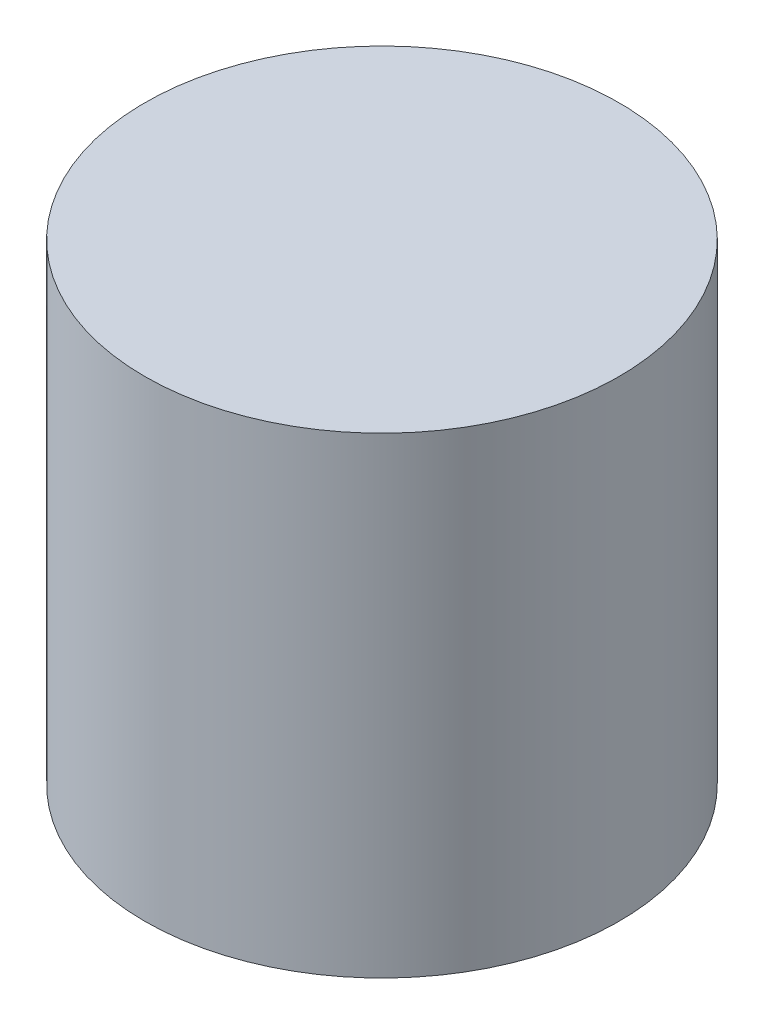
ISO-10303-21;
HEADER;
FILE_DESCRIPTION(('STEP AP214'),'2;1');
FILE_NAME('part.step','',(''),(''),'','','');
FILE_SCHEMA(('AUTOMOTIVE_DESIGN { 1 0 10303 214 1 1 1 1 }'));
ENDSEC;
DATA;
#1=APPLICATION_CONTEXT('core data for automotive mechanical design processes');
#2=APPLICATION_PROTOCOL_DEFINITION('international standard','automotive_design',2000,#1);
#3=PRODUCT_CONTEXT('',#1,'mechanical');
#4=PRODUCT('Part','Part','',(#3));
#5=PRODUCT_RELATED_PRODUCT_CATEGORY('part','',(#4));
#6=PRODUCT_DEFINITION_FORMATION('','',#4);
#7=PRODUCT_DEFINITION_CONTEXT('part definition',#1,'design');
#8=PRODUCT_DEFINITION('design','',#6,#7);
#9=PRODUCT_DEFINITION_SHAPE('','',#8);
#10=(LENGTH_UNIT() NAMED_UNIT(*) SI_UNIT(.MILLI.,.METRE.));
#11=(NAMED_UNIT(*) PLANE_ANGLE_UNIT() SI_UNIT($,.RADIAN.));
#12=(NAMED_UNIT(*) SI_UNIT($,.STERADIAN.) SOLID_ANGLE_UNIT());
#13=UNCERTAINTY_MEASURE_WITH_UNIT(LENGTH_MEASURE(1.E-05),#10,'distance_accuracy_value','');
#14=(GEOMETRIC_REPRESENTATION_CONTEXT(3) GLOBAL_UNCERTAINTY_ASSIGNED_CONTEXT((#13)) GLOBAL_UNIT_ASSIGNED_CONTEXT((#10,
#11,#12)) REPRESENTATION_CONTEXT('',''));
#15=CARTESIAN_POINT('',(0.,0.,0.));
#16=DIRECTION('',(0.,0.,1.));
#17=DIRECTION('',(1.,0.,0.));
#18=AXIS2_PLACEMENT_3D('',#15,#16,#17);
#19=CARTESIAN_POINT('',(0.,0.,0.));
#20=DIRECTION('',(0.,1.,0.));
#21=DIRECTION('',(0.,0.,1.));
#22=AXIS2_PLACEMENT_3D('',#19,#20,#21);
#23=PLANE('',#22);
#24=CARTESIAN_POINT('',(-12.5,0.,26.56));
#25=DIRECTION('',(0.,1.,0.));
#26=DIRECTION('',(0.,0.,-1.));
#27=AXIS2_PLACEMENT_3D('',#24,#25,#26);
#28=CIRCLE('',#27,2.75);
#29=CARTESIAN_POINT('',(-12.5,0.,23.81));
#30=VERTEX_POINT('',#29);
#31=EDGE_CURVE('E377',#30,#30,#28,.T.);
#32=ORIENTED_EDGE('',*,*,#31,.T.);
#33=EDGE_LOOP('',(#32));
#34=FACE_BOUND('',#33,.T.);
#35=CARTESIAN_POINT('',(-20.,0.,19.06));
#36=DIRECTION('',(0.,1.,0.));
#37=DIRECTION('',(0.,0.,-1.));
#38=AXIS2_PLACEMENT_3D('',#35,#36,#37);
#39=CIRCLE('',#38,4.9);
#40=CARTESIAN_POINT('',(-20.,0.,14.16));
#41=VERTEX_POINT('',#40);
#42=EDGE_CURVE('E386',#41,#41,#39,.T.);
#43=ORIENTED_EDGE('',*,*,#42,.T.);
#44=EDGE_LOOP('',(#43));
#45=FACE_BOUND('',#44,.T.);
#46=CARTESIAN_POINT('',(12.5,0.,26.56));
#47=DIRECTION('',(0.,1.,0.));
#48=DIRECTION('',(0.,0.,1.));
#49=AXIS2_PLACEMENT_3D('',#46,#47,#48);
#50=CIRCLE('',#49,2.75);
#51=CARTESIAN_POINT('',(12.5,0.,29.31));
#52=VERTEX_POINT('',#51);
#53=EDGE_CURVE('E396',#52,#52,#50,.T.);
#54=ORIENTED_EDGE('',*,*,#53,.T.);
#55=EDGE_LOOP('',(#54));
#56=FACE_BOUND('',#55,.T.);
#57=CARTESIAN_POINT('',(20.,0.,19.06));
#58=DIRECTION('',(0.,1.,0.));
#59=DIRECTION('',(0.,0.,1.));
#60=AXIS2_PLACEMENT_3D('',#57,#58,#59);
#61=CIRCLE('',#60,4.90000000000001);
#62=CARTESIAN_POINT('',(20.,0.,23.96));
#63=VERTEX_POINT('',#62);
#64=EDGE_CURVE('E376',#63,#63,#61,.T.);
#65=ORIENTED_EDGE('',*,*,#64,.T.);
#66=EDGE_LOOP('',(#65));
#67=FACE_BOUND('',#66,.T.);
#68=CARTESIAN_POINT('',(0.,0.,23.44));
#69=DIRECTION('',(0.,1.,0.));
#70=DIRECTION('',(0.,0.,1.));
#71=AXIS2_PLACEMENT_3D('',#68,#69,#70);
#72=CIRCLE('',#71,8.);
#73=CARTESIAN_POINT('',(0.,0.,31.44));
#74=VERTEX_POINT('',#73);
#75=EDGE_CURVE('E390',#74,#74,#72,.T.);
#76=ORIENTED_EDGE('',*,*,#75,.T.);
#77=EDGE_LOOP('',(#76));
#78=FACE_BOUND('',#77,.T.);
#79=CARTESIAN_POINT('',(-6.24500451351651E-13,0.,1.23165366794353E-13));
#80=DIRECTION('',(0.,1.,0.));
#81=DIRECTION('',(0.,0.,1.));
#82=AXIS2_PLACEMENT_3D('',#79,#80,#81);
#83=CIRCLE('',#82,33.6999999999995);
#84=CARTESIAN_POINT('',(-29.0000000000006,0.,-17.1665372163393));
#85=VERTEX_POINT('',#84);
#86=CARTESIAN_POINT('',(-29.0000000000007,0.,17.1665372163394));
#87=VERTEX_POINT('',#86);
#88=EDGE_CURVE('E151',#85,#87,#83,.T.);
#89=ORIENTED_EDGE('',*,*,#88,.T.);
#90=CARTESIAN_POINT('',(-23.5310930994231,0.,13.9292201873236));
#91=DIRECTION('',(0.,-1.,0.));
#92=DIRECTION('',(0.,0.,1.));
#93=AXIS2_PLACEMENT_3D('',#90,#91,#92);
#94=CIRCLE('',#93,6.35524698446404);
#95=CARTESIAN_POINT('',(-29.7370902241538,0.,12.56));
#96=VERTEX_POINT('',#95);
#97=EDGE_CURVE('E48',#87,#96,#94,.T.);
#98=ORIENTED_EDGE('',*,*,#97,.T.);
#99=DIRECTION('',(1.,0.,0.));
#100=VECTOR('',#99,1.);
#101=CARTESIAN_POINT('',(29.7370902241538,0.,12.56));
#102=LINE('',#101,#100);
#103=CARTESIAN_POINT('',(29.7370902241538,0.,12.56));
#104=VERTEX_POINT('',#103);
#105=EDGE_CURVE('E135',#96,#104,#102,.T.);
#106=ORIENTED_EDGE('',*,*,#105,.T.);
#107=CARTESIAN_POINT('',(23.5310930994231,0.,13.9292201873236));
#108=DIRECTION('',(0.,-1.,0.));
#109=DIRECTION('',(0.,0.,-1.));
#110=AXIS2_PLACEMENT_3D('',#107,#108,#109);
#111=CIRCLE('',#110,6.35524698446404);
#112=CARTESIAN_POINT('',(29.0000000000006,0.,17.1665372163393));
#113=VERTEX_POINT('',#112);
#114=EDGE_CURVE('E139',#104,#113,#111,.T.);
#115=ORIENTED_EDGE('',*,*,#114,.T.);
#116=CARTESIAN_POINT('',(-6.24500451351651E-13,0.,1.23165366794353E-13));
#117=DIRECTION('',(0.,1.,0.));
#118=DIRECTION('',(0.,0.,-1.));
#119=AXIS2_PLACEMENT_3D('',#116,#117,#118);
#120=CIRCLE('',#119,33.7000000000005);
#121=CARTESIAN_POINT('',(29.0000000000006,0.,-17.1665372163393));
#122=VERTEX_POINT('',#121);
#123=EDGE_CURVE('E142',#113,#122,#120,.T.);
#124=ORIENTED_EDGE('',*,*,#123,.T.);
#125=CARTESIAN_POINT('',(23.5310930994231,0.,-13.9292201873236));
#126=DIRECTION('',(0.,-1.,0.));
#127=DIRECTION('',(0.,0.,1.));
#128=AXIS2_PLACEMENT_3D('',#125,#126,#127);
#129=CIRCLE('',#128,6.35524698446404);
#130=CARTESIAN_POINT('',(29.7370902241538,0.,-12.56));
#131=VERTEX_POINT('',#130);
#132=EDGE_CURVE('E145',#122,#131,#129,.T.);
#133=ORIENTED_EDGE('',*,*,#132,.T.);
#134=DIRECTION('',(-1.,0.,0.));
#135=VECTOR('',#134,1.);
#136=CARTESIAN_POINT('',(29.7370902241538,0.,-12.56));
#137=LINE('',#136,#135);
#138=CARTESIAN_POINT('',(-29.7370902241538,0.,-12.56));
#139=VERTEX_POINT('',#138);
#140=EDGE_CURVE('E148',#131,#139,#137,.T.);
#141=ORIENTED_EDGE('',*,*,#140,.T.);
#142=CARTESIAN_POINT('',(-23.5310930994231,0.,-13.9292201873236));
#143=DIRECTION('',(0.,-1.,0.));
#144=DIRECTION('',(0.,0.,-1.));
#145=AXIS2_PLACEMENT_3D('',#142,#143,#144);
#146=CIRCLE('',#145,6.35524698446404);
#147=EDGE_CURVE('E110',#139,#85,#146,.T.);
#148=ORIENTED_EDGE('',*,*,#147,.T.);
#149=EDGE_LOOP('',(#89,#98,#106,#115,#124,#133,#141,#148));
#150=FACE_BOUND('',#149,.T.);
#151=CARTESIAN_POINT('',(0.,0.,0.));
#152=DIRECTION('',(0.,1.,0.));
#153=DIRECTION('',(0.,0.,1.));
#154=AXIS2_PLACEMENT_3D('',#151,#152,#153);
#155=CIRCLE('',#154,34.0000000000001);
#156=CARTESIAN_POINT('',(0.,0.,34.0000000000001));
#157=VERTEX_POINT('',#156);
#158=EDGE_CURVE('E11',#157,#157,#155,.T.);
#159=ORIENTED_EDGE('',*,*,#158,.F.);
#160=EDGE_LOOP('',(#159));
#161=FACE_BOUND('',#160,.T.);
#162=ADVANCED_FACE('F33',(#34,#45,#56,#67,#78,#150,#161),#23,.F.);
#163=CARTESIAN_POINT('',(-23.5310930994231,-13.7,13.9292201873236));
#164=DIRECTION('',(0.,1.,0.));
#165=DIRECTION('',(0.,0.,1.));
#166=AXIS2_PLACEMENT_3D('',#163,#164,#165);
#167=CYLINDRICAL_SURFACE('',#166,6.35524698446404);
#168=ORIENTED_EDGE('',*,*,#97,.F.);
#169=DIRECTION('',(0.,1.,0.));
#170=VECTOR('',#169,1.);
#171=CARTESIAN_POINT('',(-29.0000000000007,-13.7,17.1665372163394));
#172=LINE('',#171,#170);
#173=CARTESIAN_POINT('',(-29.0000000000007,-13.7,17.1665372163394));
#174=VERTEX_POINT('',#173);
#175=EDGE_CURVE('E53',#174,#87,#172,.T.);
#176=ORIENTED_EDGE('',*,*,#175,.F.);
#177=CARTESIAN_POINT('',(-23.5310930994231,-13.7,13.9292201873236));
#178=DIRECTION('',(0.,-1.,0.));
#179=DIRECTION('',(0.,0.,1.));
#180=AXIS2_PLACEMENT_3D('',#177,#178,#179);
#181=CIRCLE('',#180,6.35524698446404);
#182=CARTESIAN_POINT('',(-29.7370902241538,-13.7,12.56));
#183=VERTEX_POINT('',#182);
#184=EDGE_CURVE('E154',#174,#183,#181,.T.);
#185=ORIENTED_EDGE('',*,*,#184,.T.);
#186=DIRECTION('',(0.,1.,0.));
#187=VECTOR('',#186,1.);
#188=CARTESIAN_POINT('',(-29.7370902241538,-13.7,12.56));
#189=LINE('',#188,#187);
#190=EDGE_CURVE('E90',#183,#96,#189,.T.);
#191=ORIENTED_EDGE('',*,*,#190,.T.);
#192=EDGE_LOOP('',(#168,#176,#185,#191));
#193=FACE_BOUND('',#192,.T.);
#194=ADVANCED_FACE('F198',(#193),#167,.F.);
#195=CARTESIAN_POINT('',(-6.24500451351651E-13,-13.7,1.23165366794353E-13));
#196=DIRECTION('',(0.,1.,0.));
#197=DIRECTION('',(0.,0.,1.));
#198=AXIS2_PLACEMENT_3D('',#195,#196,#197);
#199=CYLINDRICAL_SURFACE('',#198,33.6999999999995);
#200=ORIENTED_EDGE('',*,*,#88,.F.);
#201=DIRECTION('',(0.,1.,0.));
#202=VECTOR('',#201,1.);
#203=CARTESIAN_POINT('',(-29.0000000000006,-13.7,-17.1665372163393));
#204=LINE('',#203,#202);
#205=CARTESIAN_POINT('',(-29.0000000000006,-13.7,-17.1665372163393));
#206=VERTEX_POINT('',#205);
#207=EDGE_CURVE('E82',#206,#85,#204,.T.);
#208=ORIENTED_EDGE('',*,*,#207,.F.);
#209=CARTESIAN_POINT('',(-6.24500451351651E-13,-13.7,1.23165366794353E-13));
#210=DIRECTION('',(0.,1.,0.));
#211=DIRECTION('',(0.,0.,1.));
#212=AXIS2_PLACEMENT_3D('',#209,#210,#211);
#213=CIRCLE('',#212,33.6999999999995);
#214=EDGE_CURVE('E124',#206,#174,#213,.T.);
#215=ORIENTED_EDGE('',*,*,#214,.T.);
#216=ORIENTED_EDGE('',*,*,#175,.T.);
#217=EDGE_LOOP('',(#200,#208,#215,#216));
#218=FACE_BOUND('',#217,.T.);
#219=ADVANCED_FACE('F200',(#218),#199,.T.);
#220=CARTESIAN_POINT('',(-23.5310930994231,-13.7,-13.9292201873236));
#221=DIRECTION('',(0.,1.,0.));
#222=DIRECTION('',(0.,0.,1.));
#223=AXIS2_PLACEMENT_3D('',#220,#221,#222);
#224=CYLINDRICAL_SURFACE('',#223,6.35524698446404);
#225=ORIENTED_EDGE('',*,*,#147,.F.);
#226=DIRECTION('',(0.,1.,0.));
#227=VECTOR('',#226,1.);
#228=CARTESIAN_POINT('',(-29.7370902241538,-13.7,-12.56));
#229=LINE('',#228,#227);
#230=CARTESIAN_POINT('',(-29.7370902241538,-13.7,-12.56));
#231=VERTEX_POINT('',#230);
#232=EDGE_CURVE('E104',#231,#139,#229,.T.);
#233=ORIENTED_EDGE('',*,*,#232,.F.);
#234=CARTESIAN_POINT('',(-23.5310930994231,-13.7,-13.9292201873236));
#235=DIRECTION('',(0.,-1.,0.));
#236=DIRECTION('',(0.,0.,-1.));
#237=AXIS2_PLACEMENT_3D('',#234,#235,#236);
#238=CIRCLE('',#237,6.35524698446404);
#239=EDGE_CURVE('E107',#231,#206,#238,.T.);
#240=ORIENTED_EDGE('',*,*,#239,.T.);
#241=ORIENTED_EDGE('',*,*,#207,.T.);
#242=EDGE_LOOP('',(#225,#233,#240,#241));
#243=FACE_BOUND('',#242,.T.);
#244=ADVANCED_FACE('F106',(#243),#224,.F.);
#245=CARTESIAN_POINT('',(29.7370902241538,-13.7,-12.56));
#246=DIRECTION('',(0.,0.,-1.));
#247=DIRECTION('',(-1.,0.,0.));
#248=AXIS2_PLACEMENT_3D('',#245,#246,#247);
#249=PLANE('',#248);
#250=ORIENTED_EDGE('',*,*,#140,.F.);
#251=DIRECTION('',(0.,1.,0.));
#252=VECTOR('',#251,1.);
#253=CARTESIAN_POINT('',(29.7370902241538,-13.7,-12.56));
#254=LINE('',#253,#252);
#255=CARTESIAN_POINT('',(29.7370902241538,-13.7,-12.56));
#256=VERTEX_POINT('',#255);
#257=EDGE_CURVE('E115',#256,#131,#254,.T.);
#258=ORIENTED_EDGE('',*,*,#257,.F.);
#259=DIRECTION('',(-1.,0.,0.));
#260=VECTOR('',#259,1.);
#261=CARTESIAN_POINT('',(29.7370902241538,-13.7,-12.56));
#262=LINE('',#261,#260);
#263=EDGE_CURVE('E121',#256,#231,#262,.T.);
#264=ORIENTED_EDGE('',*,*,#263,.T.);
#265=ORIENTED_EDGE('',*,*,#232,.T.);
#266=EDGE_LOOP('',(#250,#258,#264,#265));
#267=FACE_BOUND('',#266,.T.);
#268=ADVANCED_FACE('F126',(#267),#249,.T.);
#269=CARTESIAN_POINT('',(23.5310930994231,-13.7,-13.9292201873236));
#270=DIRECTION('',(0.,1.,0.));
#271=DIRECTION('',(0.,0.,1.));
#272=AXIS2_PLACEMENT_3D('',#269,#270,#271);
#273=CYLINDRICAL_SURFACE('',#272,6.35524698446404);
#274=ORIENTED_EDGE('',*,*,#132,.F.);
#275=DIRECTION('',(0.,1.,0.));
#276=VECTOR('',#275,1.);
#277=CARTESIAN_POINT('',(29.0000000000006,-13.7,-17.1665372163393));
#278=LINE('',#277,#276);
#279=CARTESIAN_POINT('',(29.0000000000006,-13.7,-17.1665372163393));
#280=VERTEX_POINT('',#279);
#281=EDGE_CURVE('E158',#280,#122,#278,.T.);
#282=ORIENTED_EDGE('',*,*,#281,.F.);
#283=CARTESIAN_POINT('',(23.5310930994231,-13.7,-13.9292201873236));
#284=DIRECTION('',(0.,-1.,0.));
#285=DIRECTION('',(0.,0.,1.));
#286=AXIS2_PLACEMENT_3D('',#283,#284,#285);
#287=CIRCLE('',#286,6.35524698446404);
#288=EDGE_CURVE('E127',#280,#256,#287,.T.);
#289=ORIENTED_EDGE('',*,*,#288,.T.);
#290=ORIENTED_EDGE('',*,*,#257,.T.);
#291=EDGE_LOOP('',(#274,#282,#289,#290));
#292=FACE_BOUND('',#291,.T.);
#293=ADVANCED_FACE('F236',(#292),#273,.F.);
#294=CARTESIAN_POINT('',(-6.24500451351651E-13,-13.7,1.23165366794353E-13));
#295=DIRECTION('',(0.,1.,0.));
#296=DIRECTION('',(0.,0.,1.));
#297=AXIS2_PLACEMENT_3D('',#294,#295,#296);
#298=CYLINDRICAL_SURFACE('',#297,33.7000000000005);
#299=ORIENTED_EDGE('',*,*,#123,.F.);
#300=DIRECTION('',(0.,1.,0.));
#301=VECTOR('',#300,1.);
#302=CARTESIAN_POINT('',(29.0000000000006,-13.7,17.1665372163393));
#303=LINE('',#302,#301);
#304=CARTESIAN_POINT('',(29.0000000000006,-13.7,17.1665372163393));
#305=VERTEX_POINT('',#304);
#306=EDGE_CURVE('E160',#305,#113,#303,.T.);
#307=ORIENTED_EDGE('',*,*,#306,.F.);
#308=CARTESIAN_POINT('',(-6.24500451351651E-13,-13.7,1.23165366794353E-13));
#309=DIRECTION('',(0.,1.,0.));
#310=DIRECTION('',(0.,0.,-1.));
#311=AXIS2_PLACEMENT_3D('',#308,#309,#310);
#312=CIRCLE('',#311,33.7000000000005);
#313=EDGE_CURVE('E129',#305,#280,#312,.T.);
#314=ORIENTED_EDGE('',*,*,#313,.T.);
#315=ORIENTED_EDGE('',*,*,#281,.T.);
#316=EDGE_LOOP('',(#299,#307,#314,#315));
#317=FACE_BOUND('',#316,.T.);
#318=ADVANCED_FACE('F191',(#317),#298,.T.);
#319=CARTESIAN_POINT('',(23.5310930994231,-13.7,13.9292201873236));
#320=DIRECTION('',(0.,1.,0.));
#321=DIRECTION('',(0.,0.,1.));
#322=AXIS2_PLACEMENT_3D('',#319,#320,#321);
#323=CYLINDRICAL_SURFACE('',#322,6.35524698446404);
#324=ORIENTED_EDGE('',*,*,#114,.F.);
#325=DIRECTION('',(0.,1.,0.));
#326=VECTOR('',#325,1.);
#327=CARTESIAN_POINT('',(29.7370902241538,-13.7,12.56));
#328=LINE('',#327,#326);
#329=CARTESIAN_POINT('',(29.7370902241538,-13.7,12.56));
#330=VERTEX_POINT('',#329);
#331=EDGE_CURVE('E162',#330,#104,#328,.T.);
#332=ORIENTED_EDGE('',*,*,#331,.F.);
#333=CARTESIAN_POINT('',(23.5310930994231,-13.7,13.9292201873236));
#334=DIRECTION('',(0.,-1.,0.));
#335=DIRECTION('',(0.,0.,-1.));
#336=AXIS2_PLACEMENT_3D('',#333,#334,#335);
#337=CIRCLE('',#336,6.35524698446404);
#338=EDGE_CURVE('E185',#330,#305,#337,.T.);
#339=ORIENTED_EDGE('',*,*,#338,.T.);
#340=ORIENTED_EDGE('',*,*,#306,.T.);
#341=EDGE_LOOP('',(#324,#332,#339,#340));
#342=FACE_BOUND('',#341,.T.);
#343=ADVANCED_FACE('F196',(#342),#323,.F.);
#344=CARTESIAN_POINT('',(29.7370902241538,-13.7,12.56));
#345=DIRECTION('',(0.,0.,1.));
#346=DIRECTION('',(1.,0.,0.));
#347=AXIS2_PLACEMENT_3D('',#344,#345,#346);
#348=PLANE('',#347);
#349=ORIENTED_EDGE('',*,*,#105,.F.);
#350=ORIENTED_EDGE('',*,*,#190,.F.);
#351=DIRECTION('',(1.,0.,0.));
#352=VECTOR('',#351,1.);
#353=CARTESIAN_POINT('',(29.7370902241538,-13.7,12.56));
#354=LINE('',#353,#352);
#355=EDGE_CURVE('E183',#183,#330,#354,.T.);
#356=ORIENTED_EDGE('',*,*,#355,.T.);
#357=ORIENTED_EDGE('',*,*,#331,.T.);
#358=EDGE_LOOP('',(#349,#350,#356,#357));
#359=FACE_BOUND('',#358,.T.);
#360=ADVANCED_FACE('F197',(#359),#348,.T.);
#361=CARTESIAN_POINT('',(-23.5310930994231,-13.7,13.9292201873236));
#362=DIRECTION('',(0.,1.,0.));
#363=DIRECTION('',(0.,0.,1.));
#364=AXIS2_PLACEMENT_3D('',#361,#362,#363);
#365=PLANE('',#364);
#366=ORIENTED_EDGE('',*,*,#184,.F.);
#367=ORIENTED_EDGE('',*,*,#214,.F.);
#368=ORIENTED_EDGE('',*,*,#239,.F.);
#369=ORIENTED_EDGE('',*,*,#263,.F.);
#370=ORIENTED_EDGE('',*,*,#288,.F.);
#371=ORIENTED_EDGE('',*,*,#313,.F.);
#372=ORIENTED_EDGE('',*,*,#338,.F.);
#373=ORIENTED_EDGE('',*,*,#355,.F.);
#374=EDGE_LOOP('',(#366,#367,#368,#369,#370,#371,#372,#373));
#375=FACE_BOUND('',#374,.T.);
#376=ADVANCED_FACE('F119',(#375),#365,.F.);
#377=CARTESIAN_POINT('',(0.,-44.7,0.));
#378=DIRECTION('',(0.,1.,0.));
#379=DIRECTION('',(0.,0.,1.));
#380=AXIS2_PLACEMENT_3D('',#377,#378,#379);
#381=PLANE('',#380);
#382=CARTESIAN_POINT('',(0.,-44.7,0.));
#383=DIRECTION('',(0.,1.,0.));
#384=DIRECTION('',(0.,0.,1.));
#385=AXIS2_PLACEMENT_3D('',#382,#383,#384);
#386=CIRCLE('',#385,34.0000000000001);
#387=CARTESIAN_POINT('',(0.,-44.7,34.0000000000001));
#388=VERTEX_POINT('',#387);
#389=EDGE_CURVE('E175',#388,#388,#386,.T.);
#390=ORIENTED_EDGE('',*,*,#389,.T.);
#391=EDGE_LOOP('',(#390));
#392=FACE_BOUND('',#391,.T.);
#393=CARTESIAN_POINT('',(0.,-44.7,0.));
#394=DIRECTION('',(0.,1.,0.));
#395=DIRECTION('',(0.,0.,1.));
#396=AXIS2_PLACEMENT_3D('',#393,#394,#395);
#397=CIRCLE('',#396,39.5);
#398=CARTESIAN_POINT('',(0.,-44.7,39.5));
#399=VERTEX_POINT('',#398);
#400=EDGE_CURVE('E136',#399,#399,#397,.T.);
#401=ORIENTED_EDGE('',*,*,#400,.F.);
#402=EDGE_LOOP('',(#401));
#403=FACE_BOUND('',#402,.T.);
#404=ADVANCED_FACE('F217',(#392,#403),#381,.F.);
#405=CARTESIAN_POINT('',(0.,-44.7,0.));
#406=DIRECTION('',(0.,1.,0.));
#407=DIRECTION('',(0.,0.,1.));
#408=AXIS2_PLACEMENT_3D('',#405,#406,#407);
#409=CYLINDRICAL_SURFACE('',#408,34.0000000000001);
#410=CARTESIAN_POINT('',(0.,-44.7,34.0000000000001));
#411=CARTESIAN_POINT('',(0.,-44.234375,34.0000000000001));
#412=CARTESIAN_POINT('',(0.,-43.76875,34.0000000000001));
#413=CARTESIAN_POINT('',(0.,-42.8375,34.0000000000001));
#414=CARTESIAN_POINT('',(0.,-42.371875,34.0000000000001));
#415=CARTESIAN_POINT('',(0.,-41.440625,34.0000000000001));
#416=CARTESIAN_POINT('',(0.,-40.975,34.0000000000001));
#417=CARTESIAN_POINT('',(0.,-40.04375,34.0000000000001));
#418=CARTESIAN_POINT('',(0.,-39.578125,34.0000000000001));
#419=CARTESIAN_POINT('',(0.,-38.646875,34.0000000000001));
#420=CARTESIAN_POINT('',(0.,-38.18125,34.0000000000001));
#421=CARTESIAN_POINT('',(0.,-37.25,34.0000000000001));
#422=CARTESIAN_POINT('',(0.,-36.784375,34.0000000000001));
#423=CARTESIAN_POINT('',(0.,-35.853125,34.0000000000001));
#424=CARTESIAN_POINT('',(0.,-35.3875,34.0000000000001));
#425=CARTESIAN_POINT('',(0.,-34.45625,34.0000000000001));
#426=CARTESIAN_POINT('',(0.,-33.990625,34.0000000000001));
#427=CARTESIAN_POINT('',(0.,-33.059375,34.0000000000001));
#428=CARTESIAN_POINT('',(0.,-32.59375,34.0000000000001));
#429=CARTESIAN_POINT('',(0.,-31.6625,34.0000000000001));
#430=CARTESIAN_POINT('',(0.,-31.196875,34.0000000000001));
#431=CARTESIAN_POINT('',(0.,-30.265625,34.0000000000001));
#432=CARTESIAN_POINT('',(0.,-29.8,34.0000000000001));
#433=CARTESIAN_POINT('',(0.,-28.86875,34.0000000000001));
#434=CARTESIAN_POINT('',(0.,-28.403125,34.0000000000001));
#435=CARTESIAN_POINT('',(0.,-27.471875,34.0000000000001));
#436=CARTESIAN_POINT('',(0.,-27.00625,34.0000000000001));
#437=CARTESIAN_POINT('',(0.,-26.075,34.0000000000001));
#438=CARTESIAN_POINT('',(0.,-25.609375,34.0000000000001));
#439=CARTESIAN_POINT('',(0.,-24.678125,34.0000000000001));
#440=CARTESIAN_POINT('',(0.,-24.2125,34.0000000000001));
#441=CARTESIAN_POINT('',(0.,-23.28125,34.0000000000001));
#442=CARTESIAN_POINT('',(0.,-22.815625,34.0000000000001));
#443=CARTESIAN_POINT('',(0.,-21.884375,34.0000000000001));
#444=CARTESIAN_POINT('',(0.,-21.41875,34.0000000000001));
#445=CARTESIAN_POINT('',(0.,-20.4875,34.0000000000001));
#446=CARTESIAN_POINT('',(0.,-20.021875,34.0000000000001));
#447=CARTESIAN_POINT('',(0.,-19.090625,34.0000000000001));
#448=CARTESIAN_POINT('',(0.,-18.625,34.0000000000001));
#449=CARTESIAN_POINT('',(0.,-17.69375,34.0000000000001));
#450=CARTESIAN_POINT('',(0.,-17.228125,34.0000000000001));
#451=CARTESIAN_POINT('',(0.,-16.296875,34.0000000000001));
#452=CARTESIAN_POINT('',(0.,-15.83125,34.0000000000001));
#453=CARTESIAN_POINT('',(0.,-14.9,34.0000000000001));
#454=CARTESIAN_POINT('',(0.,-14.434375,34.0000000000001));
#455=CARTESIAN_POINT('',(0.,-13.503125,34.0000000000001));
#456=CARTESIAN_POINT('',(0.,-13.0375,34.0000000000001));
#457=CARTESIAN_POINT('',(0.,-12.10625,34.0000000000001));
#458=CARTESIAN_POINT('',(0.,-11.640625,34.0000000000001));
#459=CARTESIAN_POINT('',(0.,-10.709375,34.0000000000001));
#460=CARTESIAN_POINT('',(0.,-10.24375,34.0000000000001));
#461=CARTESIAN_POINT('',(0.,-9.31250000000001,34.0000000000001));
#462=CARTESIAN_POINT('',(0.,-8.84687500000001,34.0000000000001));
#463=CARTESIAN_POINT('',(0.,-7.91562500000001,34.0000000000001));
#464=CARTESIAN_POINT('',(0.,-7.45000000000001,34.0000000000001));
#465=CARTESIAN_POINT('',(0.,-6.51875000000001,34.0000000000001));
#466=CARTESIAN_POINT('',(0.,-6.05312500000001,34.0000000000001));
#467=CARTESIAN_POINT('',(0.,-5.12187500000001,34.0000000000001));
#468=CARTESIAN_POINT('',(0.,-4.65625000000001,34.0000000000001));
#469=CARTESIAN_POINT('',(0.,-3.72500000000001,34.0000000000001));
#470=CARTESIAN_POINT('',(0.,-3.25937500000001,34.0000000000001));
#471=CARTESIAN_POINT('',(0.,-2.328125,34.0000000000001));
#472=CARTESIAN_POINT('',(0.,-1.86250000000001,34.0000000000001));
#473=CARTESIAN_POINT('',(0.,-0.931250000000006,34.0000000000001));
#474=CARTESIAN_POINT('',(0.,-0.465625000000006,34.0000000000001));
#475=CARTESIAN_POINT('',(0.,0.,34.0000000000001));
#476=B_SPLINE_CURVE_WITH_KNOTS('',3,(#410,#411,#412,#413,#414,#415,#416,#417,#418,#419,#420,
#421,#422,#423,#424,#425,#426,#427,#428,#429,#430,#431,#432,#433,#434,#435,#436,#437,#438,#439,
#440,#441,#442,#443,#444,#445,#446,#447,#448,#449,#450,#451,#452,#453,#454,#455,#456,#457,#458,
#459,#460,#461,#462,#463,#464,#465,#466,#467,#468,#469,#470,#471,#472,#473,#474,#475),
.UNSPECIFIED.,.F.,.F.,(4,2,2,2,2,2,2,2,2,2,2,2,2,2,2,2,2,2,2,2,2,2,2,2,2,2,2,2,2,2,2,2,4),(0.,
1.39687500000001,2.79375,4.190625,5.5875,6.98437500000001,8.38125,9.77812500000001,11.175,
12.571875,13.96875,15.365625,16.7625,18.159375,19.55625,20.953125,22.35,23.746875,25.14375,
26.540625,27.9375,29.334375,30.73125,32.128125,33.525,34.921875,36.31875,37.715625,39.1125,
40.509375,41.90625,43.303125,44.7),.UNSPECIFIED.);
#477=EDGE_CURVE('BSEAM213',#388,#157,#476,.T.);
#478=ORIENTED_EDGE('',*,*,#389,.F.);
#479=ORIENTED_EDGE('',*,*,#158,.T.);
#480=ORIENTED_EDGE('',*,*,#477,.T.);
#481=ORIENTED_EDGE('',*,*,#477,.F.);
#482=EDGE_LOOP('',(#478,#480,#479,#481));
#483=FACE_BOUND('',#482,.T.);
#484=ADVANCED_FACE('F213',(#483),#409,.F.);
#485=CARTESIAN_POINT('',(0.,33.9,0.));
#486=DIRECTION('',(0.,1.,0.));
#487=DIRECTION('',(0.,0.,1.));
#488=AXIS2_PLACEMENT_3D('',#485,#486,#487);
#489=PLANE('',#488);
#490=CARTESIAN_POINT('',(0.,33.9,0.));
#491=DIRECTION('',(0.,1.,0.));
#492=DIRECTION('',(0.,0.,1.));
#493=AXIS2_PLACEMENT_3D('',#490,#491,#492);
#494=CIRCLE('',#493,39.5);
#495=CARTESIAN_POINT('',(0.,33.9,39.5));
#496=VERTEX_POINT('',#495);
#497=EDGE_CURVE('E41',#496,#496,#494,.T.);
#498=ORIENTED_EDGE('',*,*,#497,.T.);
#499=EDGE_LOOP('',(#498));
#500=FACE_BOUND('',#499,.T.);
#501=ADVANCED_FACE('F167',(#500),#489,.T.);
#502=CARTESIAN_POINT('',(0.,33.9,0.));
#503=DIRECTION('',(0.,-1.,0.));
#504=DIRECTION('',(0.,0.,-1.));
#505=AXIS2_PLACEMENT_3D('',#502,#503,#504);
#506=CYLINDRICAL_SURFACE('',#505,39.5);
#507=ORIENTED_EDGE('',*,*,#497,.F.);
#508=EDGE_LOOP('',(#507));
#509=FACE_BOUND('',#508,.T.);
#510=ORIENTED_EDGE('',*,*,#400,.T.);
#511=EDGE_LOOP('',(#510));
#512=FACE_BOUND('',#511,.T.);
#513=ADVANCED_FACE('F35',(#509,#512),#506,.T.);
#514=CARTESIAN_POINT('',(0.,19.,23.44));
#515=DIRECTION('',(0.,-1.,0.));
#516=DIRECTION('',(0.,0.,-1.));
#517=AXIS2_PLACEMENT_3D('',#514,#515,#516);
#518=CYLINDRICAL_SURFACE('',#517,8.);
#519=CARTESIAN_POINT('',(0.,19.,23.44));
#520=DIRECTION('',(0.,1.,0.));
#521=DIRECTION('',(0.,0.,1.));
#522=AXIS2_PLACEMENT_3D('',#519,#520,#521);
#523=CIRCLE('',#522,8.);
#524=CARTESIAN_POINT('',(0.,19.,31.44));
#525=VERTEX_POINT('',#524);
#526=EDGE_CURVE('E178',#525,#525,#523,.T.);
#527=ORIENTED_EDGE('',*,*,#526,.T.);
#528=EDGE_LOOP('',(#527));
#529=FACE_BOUND('',#528,.T.);
#530=ORIENTED_EDGE('',*,*,#75,.F.);
#531=EDGE_LOOP('',(#530));
#532=FACE_BOUND('',#531,.T.);
#533=ADVANCED_FACE('F171',(#529,#532),#518,.F.);
#534=CARTESIAN_POINT('',(0.,19.,23.44));
#535=DIRECTION('',(0.,1.,0.));
#536=DIRECTION('',(0.,0.,1.));
#537=AXIS2_PLACEMENT_3D('',#534,#535,#536);
#538=PLANE('',#537);
#539=ORIENTED_EDGE('',*,*,#526,.F.);
#540=EDGE_LOOP('',(#539));
#541=FACE_BOUND('',#540,.T.);
#542=ADVANCED_FACE('F281',(#541),#538,.F.);
#543=CARTESIAN_POINT('',(20.,19.,19.06));
#544=DIRECTION('',(0.,-1.,0.));
#545=DIRECTION('',(0.,0.,-1.));
#546=AXIS2_PLACEMENT_3D('',#543,#544,#545);
#547=CYLINDRICAL_SURFACE('',#546,4.90000000000001);
#548=CARTESIAN_POINT('',(20.,19.,19.06));
#549=DIRECTION('',(0.,1.,0.));
#550=DIRECTION('',(0.,0.,1.));
#551=AXIS2_PLACEMENT_3D('',#548,#549,#550);
#552=CIRCLE('',#551,4.90000000000001);
#553=CARTESIAN_POINT('',(20.,19.,23.96));
#554=VERTEX_POINT('',#553);
#555=EDGE_CURVE('E380',#554,#554,#552,.T.);
#556=ORIENTED_EDGE('',*,*,#555,.T.);
#557=EDGE_LOOP('',(#556));
#558=FACE_BOUND('',#557,.T.);
#559=ORIENTED_EDGE('',*,*,#64,.F.);
#560=EDGE_LOOP('',(#559));
#561=FACE_BOUND('',#560,.T.);
#562=ADVANCED_FACE('F290',(#558,#561),#547,.F.);
#563=CARTESIAN_POINT('',(20.,19.,19.06));
#564=DIRECTION('',(0.,1.,0.));
#565=DIRECTION('',(0.,0.,1.));
#566=AXIS2_PLACEMENT_3D('',#563,#564,#565);
#567=PLANE('',#566);
#568=ORIENTED_EDGE('',*,*,#555,.F.);
#569=EDGE_LOOP('',(#568));
#570=FACE_BOUND('',#569,.T.);
#571=ADVANCED_FACE('F299',(#570),#567,.F.);
#572=CARTESIAN_POINT('',(12.5,19.,26.56));
#573=DIRECTION('',(0.,-1.,0.));
#574=DIRECTION('',(0.,0.,-1.));
#575=AXIS2_PLACEMENT_3D('',#572,#573,#574);
#576=CYLINDRICAL_SURFACE('',#575,2.75);
#577=CARTESIAN_POINT('',(12.5,19.,26.56));
#578=DIRECTION('',(0.,1.,0.));
#579=DIRECTION('',(0.,0.,1.));
#580=AXIS2_PLACEMENT_3D('',#577,#578,#579);
#581=CIRCLE('',#580,2.75);
#582=CARTESIAN_POINT('',(12.5,19.,29.31));
#583=VERTEX_POINT('',#582);
#584=EDGE_CURVE('E392',#583,#583,#581,.T.);
#585=ORIENTED_EDGE('',*,*,#584,.T.);
#586=EDGE_LOOP('',(#585));
#587=FACE_BOUND('',#586,.T.);
#588=ORIENTED_EDGE('',*,*,#53,.F.);
#589=EDGE_LOOP('',(#588));
#590=FACE_BOUND('',#589,.T.);
#591=ADVANCED_FACE('F309',(#587,#590),#576,.F.);
#592=CARTESIAN_POINT('',(12.5,19.,26.56));
#593=DIRECTION('',(0.,1.,0.));
#594=DIRECTION('',(0.,0.,1.));
#595=AXIS2_PLACEMENT_3D('',#592,#593,#594);
#596=PLANE('',#595);
#597=ORIENTED_EDGE('',*,*,#584,.F.);
#598=EDGE_LOOP('',(#597));
#599=FACE_BOUND('',#598,.T.);
#600=ADVANCED_FACE('F319',(#599),#596,.F.);
#601=CARTESIAN_POINT('',(-20.,19.,19.06));
#602=DIRECTION('',(0.,-1.,0.));
#603=DIRECTION('',(0.,0.,-1.));
#604=AXIS2_PLACEMENT_3D('',#601,#602,#603);
#605=CYLINDRICAL_SURFACE('',#604,4.9);
#606=CARTESIAN_POINT('',(-20.,19.,19.06));
#607=DIRECTION('',(0.,1.,0.));
#608=DIRECTION('',(0.,0.,-1.));
#609=AXIS2_PLACEMENT_3D('',#606,#607,#608);
#610=CIRCLE('',#609,4.9);
#611=CARTESIAN_POINT('',(-20.,19.,14.16));
#612=VERTEX_POINT('',#611);
#613=EDGE_CURVE('E383',#612,#612,#610,.T.);
#614=ORIENTED_EDGE('',*,*,#613,.T.);
#615=EDGE_LOOP('',(#614));
#616=FACE_BOUND('',#615,.T.);
#617=ORIENTED_EDGE('',*,*,#42,.F.);
#618=EDGE_LOOP('',(#617));
#619=FACE_BOUND('',#618,.T.);
#620=ADVANCED_FACE('F329',(#616,#619),#605,.F.);
#621=CARTESIAN_POINT('',(-20.,19.,19.06));
#622=DIRECTION('',(0.,-1.,0.));
#623=DIRECTION('',(0.,0.,-1.));
#624=AXIS2_PLACEMENT_3D('',#621,#622,#623);
#625=PLANE('',#624);
#626=ORIENTED_EDGE('',*,*,#613,.F.);
#627=EDGE_LOOP('',(#626));
#628=FACE_BOUND('',#627,.T.);
#629=ADVANCED_FACE('F339',(#628),#625,.T.);
#630=CARTESIAN_POINT('',(-12.5,19.,26.56));
#631=DIRECTION('',(0.,-1.,0.));
#632=DIRECTION('',(0.,0.,-1.));
#633=AXIS2_PLACEMENT_3D('',#630,#631,#632);
#634=CYLINDRICAL_SURFACE('',#633,2.75);
#635=CARTESIAN_POINT('',(-12.5,19.,26.56));
#636=DIRECTION('',(0.,1.,0.));
#637=DIRECTION('',(0.,0.,-1.));
#638=AXIS2_PLACEMENT_3D('',#635,#636,#637);
#639=CIRCLE('',#638,2.75);
#640=CARTESIAN_POINT('',(-12.5,19.,23.81));
#641=VERTEX_POINT('',#640);
#642=EDGE_CURVE('E375',#641,#641,#639,.T.);
#643=ORIENTED_EDGE('',*,*,#642,.T.);
#644=EDGE_LOOP('',(#643));
#645=FACE_BOUND('',#644,.T.);
#646=ORIENTED_EDGE('',*,*,#31,.F.);
#647=EDGE_LOOP('',(#646));
#648=FACE_BOUND('',#647,.T.);
#649=ADVANCED_FACE('F349',(#645,#648),#634,.F.);
#650=CARTESIAN_POINT('',(-12.5,19.,26.56));
#651=DIRECTION('',(0.,-1.,0.));
#652=DIRECTION('',(0.,0.,-1.));
#653=AXIS2_PLACEMENT_3D('',#650,#651,#652);
#654=PLANE('',#653);
#655=ORIENTED_EDGE('',*,*,#642,.F.);
#656=EDGE_LOOP('',(#655));
#657=FACE_BOUND('',#656,.T.);
#658=ADVANCED_FACE('F359',(#657),#654,.T.);
#659=CLOSED_SHELL('',(#162,#194,#219,#244,#268,#293,#318,#343,#360,#376,#404,#484,#501,#513,
#533,#542,#562,#571,#591,#600,#620,#629,#649,#658));
#660=MANIFOLD_SOLID_BREP('B2',#659);
#661=ADVANCED_BREP_SHAPE_REPRESENTATION('',(#18,#660),#14);
#662=SHAPE_DEFINITION_REPRESENTATION(#9,#661);
ENDSEC;
END-ISO-10303-21;
